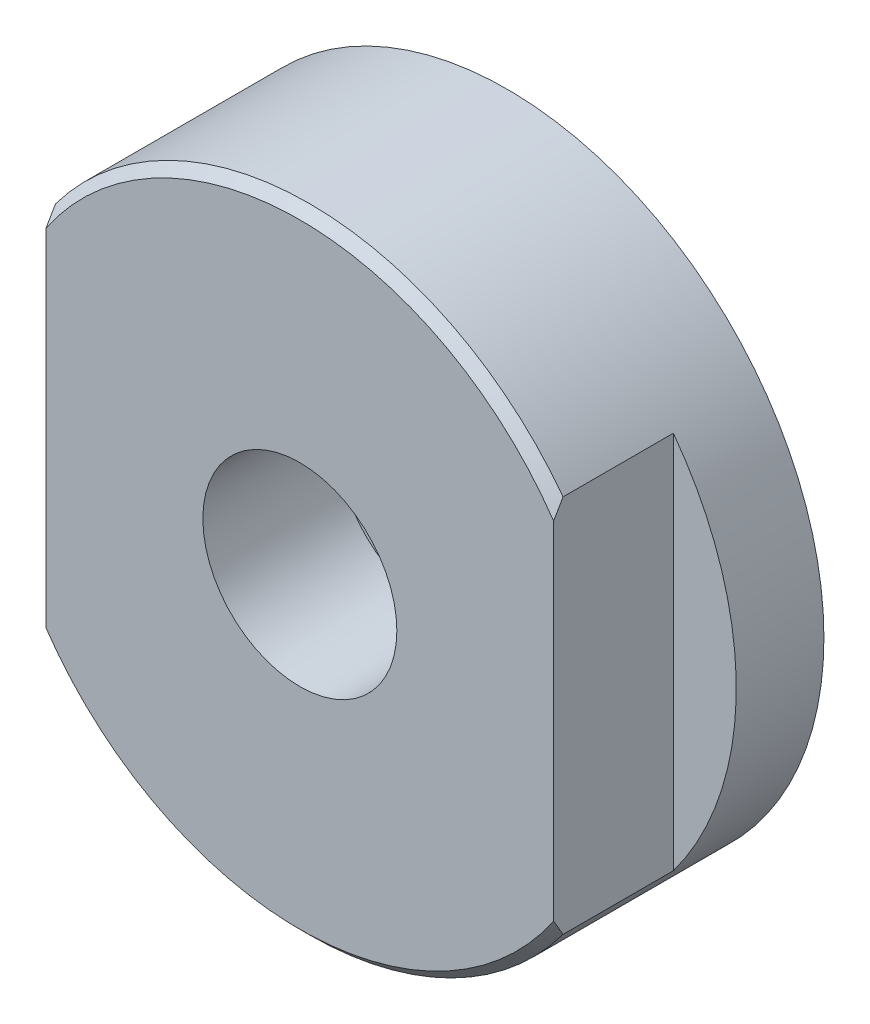
ISO-10303-21;
HEADER;
FILE_DESCRIPTION(('STEP AP214'),'2;1');
FILE_NAME('part.step','',(''),(''),'','','');
FILE_SCHEMA(('AUTOMOTIVE_DESIGN { 1 0 10303 214 1 1 1 1 }'));
ENDSEC;
DATA;
#1=APPLICATION_CONTEXT('core data for automotive mechanical design processes');
#2=APPLICATION_PROTOCOL_DEFINITION('international standard','automotive_design',2000,#1);
#3=PRODUCT_CONTEXT('',#1,'mechanical');
#4=PRODUCT('Part','Part','',(#3));
#5=PRODUCT_RELATED_PRODUCT_CATEGORY('part','',(#4));
#6=PRODUCT_DEFINITION_FORMATION('','',#4);
#7=PRODUCT_DEFINITION_CONTEXT('part definition',#1,'design');
#8=PRODUCT_DEFINITION('design','',#6,#7);
#9=PRODUCT_DEFINITION_SHAPE('','',#8);
#10=(LENGTH_UNIT() NAMED_UNIT(*) SI_UNIT(.MILLI.,.METRE.));
#11=(NAMED_UNIT(*) PLANE_ANGLE_UNIT() SI_UNIT($,.RADIAN.));
#12=(NAMED_UNIT(*) SI_UNIT($,.STERADIAN.) SOLID_ANGLE_UNIT());
#13=UNCERTAINTY_MEASURE_WITH_UNIT(LENGTH_MEASURE(1.E-05),#10,'distance_accuracy_value','');
#14=(GEOMETRIC_REPRESENTATION_CONTEXT(3) GLOBAL_UNCERTAINTY_ASSIGNED_CONTEXT((#13)) GLOBAL_UNIT_ASSIGNED_CONTEXT((#10,
#11,#12)) REPRESENTATION_CONTEXT('',''));
#15=CARTESIAN_POINT('',(0.,0.,0.));
#16=DIRECTION('',(0.,0.,1.));
#17=DIRECTION('',(1.,0.,0.));
#18=AXIS2_PLACEMENT_3D('',#15,#16,#17);
#19=CARTESIAN_POINT('',(0.,0.,11.));
#20=DIRECTION('',(0.,0.,-1.));
#21=DIRECTION('',(-1.,0.,0.));
#22=AXIS2_PLACEMENT_3D('',#19,#20,#21);
#23=CONICAL_SURFACE('',#22,16.3,0.785398163397448);
#24=CARTESIAN_POINT('',(13.462,22.1152500664714,1.40965953289599));
#25=CARTESIAN_POINT('',(13.462,21.7843991031133,1.69225636626439));
#26=CARTESIAN_POINT('',(13.462,21.4527114023601,1.97387755733035));
#27=CARTESIAN_POINT('',(13.462,20.787439888017,2.53488411675067));
#28=CARTESIAN_POINT('',(13.462,20.453856037143,2.81426944087907));
#29=CARTESIAN_POINT('',(13.462,19.7844100512555,3.37065197990872));
#30=CARTESIAN_POINT('',(13.462,19.4485468300436,3.64764788895666));
#31=CARTESIAN_POINT('',(13.462,18.7744554387229,4.19874606361961));
#32=CARTESIAN_POINT('',(13.462,18.4362272783123,4.47284834108924));
#33=CARTESIAN_POINT('',(13.462,17.7479323295138,5.02509902126975));
#34=CARTESIAN_POINT('',(13.462,17.3977926072053,5.30315661342661));
#35=CARTESIAN_POINT('',(13.462,16.6943328703862,5.85521823765053));
#36=CARTESIAN_POINT('',(13.462,16.3410128803111,6.12922230082011));
#37=CARTESIAN_POINT('',(13.462,15.6308365063995,6.67244125849601));
#38=CARTESIAN_POINT('',(13.462,15.2739809698164,6.94165725915664));
#39=CARTESIAN_POINT('',(13.462,14.5561432359145,7.47453896209526));
#40=CARTESIAN_POINT('',(13.462,14.1951610412107,7.73820466789004));
#41=CARTESIAN_POINT('',(13.462,13.4677807908375,8.25946215770953));
#42=CARTESIAN_POINT('',(13.462,13.101373685025,8.51704133873447));
#43=CARTESIAN_POINT('',(13.462,12.3631263937469,9.0243221474891));
#44=CARTESIAN_POINT('',(13.462,11.9912861453437,9.27402368385807));
#45=CARTESIAN_POINT('',(13.462,11.2410522675208,9.76415234672223));
#46=CARTESIAN_POINT('',(13.462,10.8626531171971,10.0045710493569));
#47=CARTESIAN_POINT('',(13.462,10.0987398666719,10.4738555428562));
#48=CARTESIAN_POINT('',(13.462,9.71322591861934,10.7027215803827));
#49=CARTESIAN_POINT('',(13.462,8.93794836136059,11.1441401236943));
#50=CARTESIAN_POINT('',(13.462,8.54826397755875,11.3568310754449));
#51=CARTESIAN_POINT('',(13.462,7.7599826656596,11.7652292752714));
#52=CARTESIAN_POINT('',(13.462,7.36138471280793,11.9609345578226));
#53=CARTESIAN_POINT('',(13.462,6.5551630089602,12.3311114369306));
#54=CARTESIAN_POINT('',(13.462,6.14755531899303,12.5056177019946));
#55=CARTESIAN_POINT('',(13.462,5.32235412954674,12.8290342094595));
#56=CARTESIAN_POINT('',(13.462,4.90476331663721,12.9779512518133));
#57=CARTESIAN_POINT('',(13.462,4.04554000486839,13.2493585658461));
#58=CARTESIAN_POINT('',(13.462,3.60356994898546,13.3708039940975));
#59=CARTESIAN_POINT('',(13.462,2.93399810656554,13.5236990264686));
#60=CARTESIAN_POINT('',(13.462,2.70968468869802,13.5697879501569));
#61=CARTESIAN_POINT('',(13.462,2.25917767773502,13.651545734528));
#62=CARTESIAN_POINT('',(13.462,2.03298434434993,13.6872160107238));
#63=CARTESIAN_POINT('',(13.462,1.58011710228641,13.7474333171114));
#64=CARTESIAN_POINT('',(13.462,1.35344953819499,13.7720279432535));
#65=CARTESIAN_POINT('',(13.462,0.899196178732622,13.8099005355743));
#66=CARTESIAN_POINT('',(13.462,0.671610511446186,13.8231800289648));
#67=CARTESIAN_POINT('',(13.462,0.216045910064114,13.8381913882505));
#68=CARTESIAN_POINT('',(13.462,-0.0119330421317525,13.8399227076682));
#69=CARTESIAN_POINT('',(13.462,-0.46768326249953,13.8318057585023));
#70=CARTESIAN_POINT('',(13.462,-0.695454530281543,13.8219574682243));
#71=CARTESIAN_POINT('',(13.462,-1.14972446421615,13.7908888983066));
#72=CARTESIAN_POINT('',(13.462,-1.37622481742138,13.7696932646963));
#73=CARTESIAN_POINT('',(13.462,-1.82793677577188,13.716317218805));
#74=CARTESIAN_POINT('',(13.462,-2.05314821448072,13.6841354190401));
#75=CARTESIAN_POINT('',(13.462,-2.72613196657787,13.5718576584461));
#76=CARTESIAN_POINT('',(13.462,-3.17134322782695,13.4760228768823));
#77=CARTESIAN_POINT('',(13.462,-4.05473703396553,13.2471408477532));
#78=CARTESIAN_POINT('',(13.462,-4.49286159319736,13.1138744003937));
#79=CARTESIAN_POINT('',(13.462,-5.14193417315292,12.8908492888588));
#80=CARTESIAN_POINT('',(13.462,-5.3569481875956,12.8126495730774));
#81=CARTESIAN_POINT('',(13.462,-5.78430227842242,12.6492441406957));
#82=CARTESIAN_POINT('',(13.462,-5.99664230136358,12.5640382843245));
#83=CARTESIAN_POINT('',(13.462,-6.77096127002108,12.2398090731213));
#84=CARTESIAN_POINT('',(13.462,-7.32489536266652,11.9814490164044));
#85=CARTESIAN_POINT('',(13.462,-8.41576364444576,11.430891216448));
#86=CARTESIAN_POINT('',(13.462,-8.95268695896395,11.1386723625092));
#87=CARTESIAN_POINT('',(13.462,-10.0129473610895,10.5281064051659));
#88=CARTESIAN_POINT('',(13.462,-10.5362517605686,10.2097029230341));
#89=CARTESIAN_POINT('',(13.462,-11.570308014653,9.55350960995729));
#90=CARTESIAN_POINT('',(13.462,-12.0810625739396,9.2157240094307));
#91=CARTESIAN_POINT('',(13.462,-13.0945731042191,8.52353256721298));
#92=CARTESIAN_POINT('',(13.462,-13.5972816626804,8.16905762079438));
#93=CARTESIAN_POINT('',(13.462,-14.594082478034,7.44819250038603));
#94=CARTESIAN_POINT('',(13.462,-15.0881743623627,7.08180181314176));
#95=CARTESIAN_POINT('',(13.462,-16.0685933829619,6.33997637063483));
#96=CARTESIAN_POINT('',(13.462,-16.55492892185,5.96455268983195));
#97=CARTESIAN_POINT('',(13.462,-17.5215817685607,5.20607525817664));
#98=CARTESIAN_POINT('',(13.462,-18.0018992315357,4.82302170469255));
#99=CARTESIAN_POINT('',(13.462,-18.7873259419885,4.18817770701107));
#100=CARTESIAN_POINT('',(13.462,-19.0939192164089,3.93821833819089));
#101=CARTESIAN_POINT('',(13.462,-19.7052566172668,3.4359643436651));
#102=CARTESIAN_POINT('',(13.462,-20.0100004877622,3.18366940641081));
#103=CARTESIAN_POINT('',(13.462,-20.6157166118332,2.67876125727252));
#104=CARTESIAN_POINT('',(13.462,-20.9167004191878,2.42616189440049));
#105=CARTESIAN_POINT('',(13.462,-21.5171006216023,1.91919407405614));
#106=CARTESIAN_POINT('',(13.462,-21.8165172358528,1.66482587622859));
#107=CARTESIAN_POINT('',(13.462,-22.1152500664714,1.40965953289599));
#108=B_SPLINE_CURVE_WITH_KNOTS('',3,(#24,#25,#26,#27,#28,#29,#30,#31,#32,#33,#34,#35,#36,#37,
#38,#39,#40,#41,#42,#43,#44,#45,#46,#47,#48,#49,#50,#51,#52,#53,#54,#55,#56,#57,#58,#59,#60,#61,
#62,#63,#64,#65,#66,#67,#68,#69,#70,#71,#72,#73,#74,#75,#76,#77,#78,#79,#80,#81,#82,#83,#84,#85,
#86,#87,#88,#89,#90,#91,#92,#93,#94,#95,#96,#97,#98,#99,#100,#101,#102,#103,#104,#105,#106,
#107),.UNSPECIFIED.,.F.,.F.,(4,2,2,2,2,2,2,2,2,2,2,2,2,2,2,2,2,2,2,2,2,2,2,2,2,2,2,2,2,2,2,2,2,
2,2,2,2,2,2,2,2,4),(0.,1.30534095296158,2.61070766237272,3.91674755127345,5.22278208751964,
6.56410812208407,7.90542385937738,9.24642558714189,10.5874264651956,11.930996215219,
13.2745815415243,14.6193587664932,15.9641072668725,17.2956142281385,18.6272750620651,
19.9567279348748,21.2858269772993,22.6591740227139,23.3459683099858,24.0326692435954,
24.7163903438836,25.4000191472137,26.0836803006884,26.7673427350047,27.4495262672904,
28.1317959869782,29.4960673036231,30.868500606911,31.5547749347786,32.241062956977,
34.0729684491996,35.9060223296379,37.7431318736884,39.5798419569545,41.4249736176352,
43.2701848604186,45.1132388184732,46.956245162454,48.1429580385022,49.3298315627222,
50.5086284528273,51.6872558155483),.UNSPECIFIED.);
#109=CARTESIAN_POINT('',(13.462,10.0505997830975,10.5));
#110=VERTEX_POINT('',#109);
#111=CARTESIAN_POINT('',(13.462,9.19046005377315,11.));
#112=VERTEX_POINT('',#111);
#113=EDGE_CURVE('E11',#110,#112,#108,.T.);
#114=ORIENTED_EDGE('',*,*,#113,.F.);
#115=CARTESIAN_POINT('',(0.,0.,10.5));
#116=DIRECTION('',(0.,0.,1.));
#117=DIRECTION('',(1.,0.,0.));
#118=AXIS2_PLACEMENT_3D('',#115,#116,#117);
#119=CIRCLE('',#118,16.8);
#120=CARTESIAN_POINT('',(-13.462,10.0505997830975,10.5));
#121=VERTEX_POINT('',#120);
#122=EDGE_CURVE('E107',#121,#110,#119,.F.);
#123=ORIENTED_EDGE('',*,*,#122,.F.);
#124=CARTESIAN_POINT('',(-13.462,-22.1152500664714,1.40965953289599));
#125=CARTESIAN_POINT('',(-13.462,-21.7843991031133,1.69225636626439));
#126=CARTESIAN_POINT('',(-13.462,-21.45271140236,1.97387755733034));
#127=CARTESIAN_POINT('',(-13.462,-20.787439888017,2.53488411675067));
#128=CARTESIAN_POINT('',(-13.462,-20.453856037143,2.81426944087907));
#129=CARTESIAN_POINT('',(-13.462,-19.7844100512555,3.37065197990872));
#130=CARTESIAN_POINT('',(-13.462,-19.4485468300436,3.64764788895666));
#131=CARTESIAN_POINT('',(-13.462,-18.7744554387229,4.19874606361961));
#132=CARTESIAN_POINT('',(-13.462,-18.4362272783123,4.47284834108924));
#133=CARTESIAN_POINT('',(-13.462,-17.7479323295138,5.02509902126975));
#134=CARTESIAN_POINT('',(-13.462,-17.3977926072053,5.30315661342661));
#135=CARTESIAN_POINT('',(-13.462,-16.6943328703862,5.85521823765053));
#136=CARTESIAN_POINT('',(-13.462,-16.3410128803111,6.12922230082011));
#137=CARTESIAN_POINT('',(-13.462,-15.6308365063995,6.67244125849601));
#138=CARTESIAN_POINT('',(-13.462,-15.2739809698164,6.94165725915664));
#139=CARTESIAN_POINT('',(-13.462,-14.5561432359145,7.47453896209526));
#140=CARTESIAN_POINT('',(-13.462,-14.1951610412107,7.73820466789004));
#141=CARTESIAN_POINT('',(-13.462,-13.4677807908375,8.25946215770953));
#142=CARTESIAN_POINT('',(-13.462,-13.101373685025,8.51704133873447));
#143=CARTESIAN_POINT('',(-13.462,-12.3631263937469,9.0243221474891));
#144=CARTESIAN_POINT('',(-13.462,-11.9912861453437,9.27402368385807));
#145=CARTESIAN_POINT('',(-13.462,-11.2410522675208,9.76415234672223));
#146=CARTESIAN_POINT('',(-13.462,-10.8626531171971,10.0045710493569));
#147=CARTESIAN_POINT('',(-13.462,-10.0987398666719,10.4738555428562));
#148=CARTESIAN_POINT('',(-13.462,-9.71322591861934,10.7027215803827));
#149=CARTESIAN_POINT('',(-13.462,-8.93794836136059,11.1441401236943));
#150=CARTESIAN_POINT('',(-13.462,-8.54826397755875,11.3568310754449));
#151=CARTESIAN_POINT('',(-13.462,-7.7599826656596,11.7652292752714));
#152=CARTESIAN_POINT('',(-13.462,-7.36138471280793,11.9609345578226));
#153=CARTESIAN_POINT('',(-13.462,-6.5551630089602,12.3311114369306));
#154=CARTESIAN_POINT('',(-13.462,-6.14755531899303,12.5056177019946));
#155=CARTESIAN_POINT('',(-13.462,-5.32235412954674,12.8290342094595));
#156=CARTESIAN_POINT('',(-13.462,-4.90476331663721,12.9779512518133));
#157=CARTESIAN_POINT('',(-13.462,-4.04554000486839,13.2493585658461));
#158=CARTESIAN_POINT('',(-13.462,-3.60356994898546,13.3708039940975));
#159=CARTESIAN_POINT('',(-13.462,-2.93399810656554,13.5236990264686));
#160=CARTESIAN_POINT('',(-13.462,-2.70968468869802,13.5697879501569));
#161=CARTESIAN_POINT('',(-13.462,-2.25917767773502,13.651545734528));
#162=CARTESIAN_POINT('',(-13.462,-2.03298434434993,13.6872160107238));
#163=CARTESIAN_POINT('',(-13.462,-1.58011710228641,13.7474333171114));
#164=CARTESIAN_POINT('',(-13.462,-1.35344953819499,13.7720279432535));
#165=CARTESIAN_POINT('',(-13.462,-0.899196178732622,13.8099005355743));
#166=CARTESIAN_POINT('',(-13.462,-0.671610511446186,13.8231800289648));
#167=CARTESIAN_POINT('',(-13.462,-0.216045910064114,13.8381913882505));
#168=CARTESIAN_POINT('',(-13.462,0.0119330421317525,13.8399227076682));
#169=CARTESIAN_POINT('',(-13.462,0.46768326249953,13.8318057585023));
#170=CARTESIAN_POINT('',(-13.462,0.695454530281543,13.8219574682243));
#171=CARTESIAN_POINT('',(-13.462,1.14972446421615,13.7908888983066));
#172=CARTESIAN_POINT('',(-13.462,1.37622481742138,13.7696932646963));
#173=CARTESIAN_POINT('',(-13.462,1.82793677577188,13.716317218805));
#174=CARTESIAN_POINT('',(-13.462,2.05314821448072,13.6841354190401));
#175=CARTESIAN_POINT('',(-13.462,2.72613196657787,13.5718576584461));
#176=CARTESIAN_POINT('',(-13.462,3.17134322782695,13.4760228768823));
#177=CARTESIAN_POINT('',(-13.462,4.05473703396553,13.2471408477532));
#178=CARTESIAN_POINT('',(-13.462,4.49286159319736,13.1138744003937));
#179=CARTESIAN_POINT('',(-13.462,5.14193417315292,12.8908492888588));
#180=CARTESIAN_POINT('',(-13.462,5.3569481875956,12.8126495730774));
#181=CARTESIAN_POINT('',(-13.462,5.78430227842242,12.6492441406957));
#182=CARTESIAN_POINT('',(-13.462,5.99664230136358,12.5640382843245));
#183=CARTESIAN_POINT('',(-13.462,6.77096127002108,12.2398090731213));
#184=CARTESIAN_POINT('',(-13.462,7.32489536266652,11.9814490164044));
#185=CARTESIAN_POINT('',(-13.462,8.41576364444576,11.430891216448));
#186=CARTESIAN_POINT('',(-13.462,8.95268695896395,11.1386723625092));
#187=CARTESIAN_POINT('',(-13.462,10.0129473610895,10.5281064051659));
#188=CARTESIAN_POINT('',(-13.462,10.5362517605686,10.2097029230341));
#189=CARTESIAN_POINT('',(-13.462,11.570308014653,9.55350960995729));
#190=CARTESIAN_POINT('',(-13.462,12.0810625739396,9.2157240094307));
#191=CARTESIAN_POINT('',(-13.462,13.0945731042191,8.52353256721298));
#192=CARTESIAN_POINT('',(-13.462,13.5972816626804,8.16905762079438));
#193=CARTESIAN_POINT('',(-13.462,14.594082478034,7.44819250038603));
#194=CARTESIAN_POINT('',(-13.462,15.0881743623627,7.08180181314176));
#195=CARTESIAN_POINT('',(-13.462,16.0685933829619,6.33997637063483));
#196=CARTESIAN_POINT('',(-13.462,16.55492892185,5.96455268983195));
#197=CARTESIAN_POINT('',(-13.462,17.5215817685607,5.20607525817664));
#198=CARTESIAN_POINT('',(-13.462,18.0018992315357,4.82302170469255));
#199=CARTESIAN_POINT('',(-13.462,18.7873259419885,4.18817770701107));
#200=CARTESIAN_POINT('',(-13.462,19.0939192164089,3.93821833819089));
#201=CARTESIAN_POINT('',(-13.462,19.7052566172668,3.4359643436651));
#202=CARTESIAN_POINT('',(-13.462,20.0100004877622,3.18366940641081));
#203=CARTESIAN_POINT('',(-13.462,20.6157166118332,2.67876125727252));
#204=CARTESIAN_POINT('',(-13.462,20.9167004191878,2.42616189440049));
#205=CARTESIAN_POINT('',(-13.462,21.5171006216023,1.91919407405614));
#206=CARTESIAN_POINT('',(-13.462,21.8165172358528,1.66482587622859));
#207=CARTESIAN_POINT('',(-13.462,22.1152500664714,1.40965953289599));
#208=B_SPLINE_CURVE_WITH_KNOTS('',3,(#124,#125,#126,#127,#128,#129,#130,#131,#132,#133,#134,
#135,#136,#137,#138,#139,#140,#141,#142,#143,#144,#145,#146,#147,#148,#149,#150,#151,#152,#153,
#154,#155,#156,#157,#158,#159,#160,#161,#162,#163,#164,#165,#166,#167,#168,#169,#170,#171,#172,
#173,#174,#175,#176,#177,#178,#179,#180,#181,#182,#183,#184,#185,#186,#187,#188,#189,#190,#191,
#192,#193,#194,#195,#196,#197,#198,#199,#200,#201,#202,#203,#204,#205,#206,#207),.UNSPECIFIED.,
.F.,.F.,(4,2,2,2,2,2,2,2,2,2,2,2,2,2,2,2,2,2,2,2,2,2,2,2,2,2,2,2,2,2,2,2,2,2,2,2,2,2,2,2,2,4),
(0.,1.30534095296158,2.61070766237272,3.91674755127344,5.22278208751964,6.56410812208406,
7.90542385937738,9.24642558714189,10.5874264651956,11.930996215219,13.2745815415243,
14.6193587664932,15.9641072668725,17.2956142281385,18.6272750620651,19.9567279348748,
21.2858269772993,22.6591740227139,23.3459683099858,24.0326692435954,24.7163903438836,
25.4000191472137,26.0836803006884,26.7673427350047,27.4495262672904,28.1317959869782,
29.4960673036231,30.868500606911,31.5547749347786,32.241062956977,34.0729684491996,
35.9060223296379,37.7431318736884,39.5798419569545,41.4249736176352,43.2701848604186,
45.1132388184732,46.956245162454,48.1429580385022,49.3298315627222,50.5086284528273,
51.6872558155483),.UNSPECIFIED.);
#209=CARTESIAN_POINT('',(-13.462,9.19046005377315,11.));
#210=VERTEX_POINT('',#209);
#211=EDGE_CURVE('E132',#210,#121,#208,.T.);
#212=ORIENTED_EDGE('',*,*,#211,.F.);
#213=CARTESIAN_POINT('',(0.,0.,11.));
#214=DIRECTION('',(0.,0.,1.));
#215=DIRECTION('',(1.,0.,0.));
#216=AXIS2_PLACEMENT_3D('',#213,#214,#215);
#217=CIRCLE('',#216,16.3);
#218=EDGE_CURVE('E57',#112,#210,#217,.T.);
#219=ORIENTED_EDGE('',*,*,#218,.F.);
#220=EDGE_LOOP('',(#114,#123,#212,#219));
#221=FACE_BOUND('',#220,.T.);
#222=ADVANCED_FACE('F34',(#221),#23,.T.);
#223=CARTESIAN_POINT('',(0.,0.,11.));
#224=DIRECTION('',(0.,0.,-1.));
#225=DIRECTION('',(-1.,0.,0.));
#226=AXIS2_PLACEMENT_3D('',#223,#224,#225);
#227=CYLINDRICAL_SURFACE('',#226,16.8);
#228=ORIENTED_EDGE('',*,*,#122,.T.);
#229=DIRECTION('',(0.,0.,1.));
#230=VECTOR('',#229,1.);
#231=CARTESIAN_POINT('',(13.462,10.0505997830975,4.65));
#232=LINE('',#231,#230);
#233=CARTESIAN_POINT('',(13.462,10.0505997830975,4.65));
#234=VERTEX_POINT('',#233);
#235=EDGE_CURVE('E98',#234,#110,#232,.T.);
#236=ORIENTED_EDGE('',*,*,#235,.F.);
#237=CARTESIAN_POINT('',(0.,0.,4.65));
#238=DIRECTION('',(0.,0.,1.));
#239=DIRECTION('',(-1.,0.,0.));
#240=AXIS2_PLACEMENT_3D('',#237,#238,#239);
#241=CIRCLE('',#240,16.8);
#242=CARTESIAN_POINT('',(13.462,-10.0505997830975,4.65));
#243=VERTEX_POINT('',#242);
#244=EDGE_CURVE('E89',#243,#234,#241,.T.);
#245=ORIENTED_EDGE('',*,*,#244,.F.);
#246=DIRECTION('',(0.,0.,1.));
#247=VECTOR('',#246,1.);
#248=CARTESIAN_POINT('',(13.462,-10.0505997830975,4.65));
#249=LINE('',#248,#247);
#250=CARTESIAN_POINT('',(13.462,-10.0505997830975,10.5));
#251=VERTEX_POINT('',#250);
#252=EDGE_CURVE('E100',#243,#251,#249,.T.);
#253=ORIENTED_EDGE('',*,*,#252,.T.);
#254=CARTESIAN_POINT('',(-13.462,-10.0505997830975,10.5));
#255=VERTEX_POINT('',#254);
#256=EDGE_CURVE('E130',#251,#255,#119,.F.);
#257=ORIENTED_EDGE('',*,*,#256,.T.);
#258=DIRECTION('',(0.,0.,1.));
#259=VECTOR('',#258,1.);
#260=CARTESIAN_POINT('',(-13.462,-10.0505997830975,4.65));
#261=LINE('',#260,#259);
#262=CARTESIAN_POINT('',(-13.462,-10.0505997830975,4.65));
#263=VERTEX_POINT('',#262);
#264=EDGE_CURVE('E118',#263,#255,#261,.T.);
#265=ORIENTED_EDGE('',*,*,#264,.F.);
#266=CARTESIAN_POINT('',(0.,0.,4.65));
#267=DIRECTION('',(0.,0.,1.));
#268=DIRECTION('',(1.,0.,0.));
#269=AXIS2_PLACEMENT_3D('',#266,#267,#268);
#270=CIRCLE('',#269,16.8);
#271=CARTESIAN_POINT('',(-13.462,10.0505997830975,4.65));
#272=VERTEX_POINT('',#271);
#273=EDGE_CURVE('E113',#272,#263,#270,.T.);
#274=ORIENTED_EDGE('',*,*,#273,.F.);
#275=DIRECTION('',(0.,0.,1.));
#276=VECTOR('',#275,1.);
#277=CARTESIAN_POINT('',(-13.462,10.0505997830975,4.65));
#278=LINE('',#277,#276);
#279=EDGE_CURVE('E120',#272,#121,#278,.T.);
#280=ORIENTED_EDGE('',*,*,#279,.T.);
#281=EDGE_LOOP('',(#228,#236,#245,#253,#257,#265,#274,#280));
#282=FACE_BOUND('',#281,.T.);
#283=CARTESIAN_POINT('',(0.,0.,0.));
#284=DIRECTION('',(0.,0.,1.));
#285=DIRECTION('',(1.,0.,0.));
#286=AXIS2_PLACEMENT_3D('',#283,#284,#285);
#287=CIRCLE('',#286,16.8);
#288=CARTESIAN_POINT('',(16.8,0.,0.));
#289=VERTEX_POINT('',#288);
#290=EDGE_CURVE('E122',#289,#289,#287,.T.);
#291=ORIENTED_EDGE('',*,*,#290,.T.);
#292=EDGE_LOOP('',(#291));
#293=FACE_BOUND('',#292,.T.);
#294=ADVANCED_FACE('F103',(#282,#293),#227,.T.);
#295=CARTESIAN_POINT('',(0.,0.,11.));
#296=DIRECTION('',(0.,0.,1.));
#297=DIRECTION('',(1.,0.,0.));
#298=AXIS2_PLACEMENT_3D('',#295,#296,#297);
#299=PLANE('',#298);
#300=CARTESIAN_POINT('',(0.,0.,11.));
#301=DIRECTION('',(0.,0.,1.));
#302=DIRECTION('',(1.,0.,0.));
#303=AXIS2_PLACEMENT_3D('',#300,#301,#302);
#304=CIRCLE('',#303,5.1457733);
#305=CARTESIAN_POINT('',(5.1457733,0.,11.));
#306=VERTEX_POINT('',#305);
#307=EDGE_CURVE('E204',#306,#306,#304,.T.);
#308=ORIENTED_EDGE('',*,*,#307,.F.);
#309=EDGE_LOOP('',(#308));
#310=FACE_BOUND('',#309,.T.);
#311=DIRECTION('',(0.,-1.,0.));
#312=VECTOR('',#311,1.);
#313=CARTESIAN_POINT('',(13.462,-10.0505997830975,11.));
#314=LINE('',#313,#312);
#315=CARTESIAN_POINT('',(13.462,-9.19046005377315,11.));
#316=VERTEX_POINT('',#315);
#317=EDGE_CURVE('E50',#112,#316,#314,.T.);
#318=ORIENTED_EDGE('',*,*,#317,.F.);
#319=ORIENTED_EDGE('',*,*,#218,.T.);
#320=DIRECTION('',(0.,1.,0.));
#321=VECTOR('',#320,1.);
#322=CARTESIAN_POINT('',(-13.462,-10.0505997830975,11.));
#323=LINE('',#322,#321);
#324=CARTESIAN_POINT('',(-13.462,-9.19046005377315,11.));
#325=VERTEX_POINT('',#324);
#326=EDGE_CURVE('E109',#325,#210,#323,.T.);
#327=ORIENTED_EDGE('',*,*,#326,.F.);
#328=EDGE_CURVE('E127',#325,#316,#217,.T.);
#329=ORIENTED_EDGE('',*,*,#328,.T.);
#330=EDGE_LOOP('',(#318,#319,#327,#329));
#331=FACE_BOUND('',#330,.T.);
#332=ADVANCED_FACE('F149',(#310,#331),#299,.T.);
#333=CARTESIAN_POINT('',(0.,0.,0.));
#334=DIRECTION('',(0.,0.,1.));
#335=DIRECTION('',(1.,0.,0.));
#336=AXIS2_PLACEMENT_3D('',#333,#334,#335);
#337=PLANE('',#336);
#338=CARTESIAN_POINT('',(0.,0.,0.));
#339=DIRECTION('',(0.,0.,1.));
#340=DIRECTION('',(1.,0.,0.));
#341=AXIS2_PLACEMENT_3D('',#338,#339,#340);
#342=CIRCLE('',#341,4.2164);
#343=CARTESIAN_POINT('',(4.2164,0.,0.));
#344=VERTEX_POINT('',#343);
#345=EDGE_CURVE('E39',#344,#344,#342,.T.);
#346=ORIENTED_EDGE('',*,*,#345,.T.);
#347=EDGE_LOOP('',(#346));
#348=FACE_BOUND('',#347,.T.);
#349=ORIENTED_EDGE('',*,*,#290,.F.);
#350=EDGE_LOOP('',(#349));
#351=FACE_BOUND('',#350,.T.);
#352=ADVANCED_FACE('F152',(#348,#351),#337,.F.);
#353=EDGE_CURVE('E44',#316,#251,#108,.T.);
#354=ORIENTED_EDGE('',*,*,#353,.F.);
#355=ORIENTED_EDGE('',*,*,#328,.F.);
#356=EDGE_CURVE('E137',#255,#325,#208,.T.);
#357=ORIENTED_EDGE('',*,*,#356,.F.);
#358=ORIENTED_EDGE('',*,*,#256,.F.);
#359=EDGE_LOOP('',(#354,#355,#357,#358));
#360=FACE_BOUND('',#359,.T.);
#361=ADVANCED_FACE('F36',(#360),#23,.T.);
#362=CARTESIAN_POINT('',(-13.462,-10.0505997830975,4.65));
#363=DIRECTION('',(1.,0.,0.));
#364=DIRECTION('',(0.,0.,-1.));
#365=AXIS2_PLACEMENT_3D('',#362,#363,#364);
#366=PLANE('',#365);
#367=ORIENTED_EDGE('',*,*,#356,.T.);
#368=ORIENTED_EDGE('',*,*,#326,.T.);
#369=ORIENTED_EDGE('',*,*,#211,.T.);
#370=ORIENTED_EDGE('',*,*,#279,.F.);
#371=DIRECTION('',(0.,1.,0.));
#372=VECTOR('',#371,1.);
#373=CARTESIAN_POINT('',(-13.462,-10.0505997830975,4.65));
#374=LINE('',#373,#372);
#375=EDGE_CURVE('E115',#263,#272,#374,.T.);
#376=ORIENTED_EDGE('',*,*,#375,.F.);
#377=ORIENTED_EDGE('',*,*,#264,.T.);
#378=EDGE_LOOP('',(#367,#368,#369,#370,#376,#377));
#379=FACE_BOUND('',#378,.T.);
#380=ADVANCED_FACE('F142',(#379),#366,.F.);
#381=CARTESIAN_POINT('',(0.,0.,4.65));
#382=DIRECTION('',(0.,0.,1.));
#383=DIRECTION('',(1.,0.,0.));
#384=AXIS2_PLACEMENT_3D('',#381,#382,#383);
#385=PLANE('',#384);
#386=ORIENTED_EDGE('',*,*,#273,.T.);
#387=ORIENTED_EDGE('',*,*,#375,.T.);
#388=EDGE_LOOP('',(#386,#387));
#389=FACE_BOUND('',#388,.T.);
#390=ADVANCED_FACE('F147',(#389),#385,.T.);
#391=CARTESIAN_POINT('',(13.462,-10.0505997830975,4.65));
#392=DIRECTION('',(-1.,0.,0.));
#393=DIRECTION('',(0.,0.,1.));
#394=AXIS2_PLACEMENT_3D('',#391,#392,#393);
#395=PLANE('',#394);
#396=ORIENTED_EDGE('',*,*,#113,.T.);
#397=ORIENTED_EDGE('',*,*,#317,.T.);
#398=ORIENTED_EDGE('',*,*,#353,.T.);
#399=ORIENTED_EDGE('',*,*,#252,.F.);
#400=DIRECTION('',(0.,-1.,0.));
#401=VECTOR('',#400,1.);
#402=CARTESIAN_POINT('',(13.462,-10.0505997830975,4.65));
#403=LINE('',#402,#401);
#404=EDGE_CURVE('E92',#234,#243,#403,.T.);
#405=ORIENTED_EDGE('',*,*,#404,.F.);
#406=ORIENTED_EDGE('',*,*,#235,.T.);
#407=EDGE_LOOP('',(#396,#397,#398,#399,#405,#406));
#408=FACE_BOUND('',#407,.T.);
#409=ADVANCED_FACE('F97',(#408),#395,.F.);
#410=CARTESIAN_POINT('',(0.,0.,4.65));
#411=DIRECTION('',(0.,0.,-1.));
#412=DIRECTION('',(-1.,0.,0.));
#413=AXIS2_PLACEMENT_3D('',#410,#411,#412);
#414=PLANE('',#413);
#415=ORIENTED_EDGE('',*,*,#244,.T.);
#416=ORIENTED_EDGE('',*,*,#404,.T.);
#417=EDGE_LOOP('',(#415,#416));
#418=FACE_BOUND('',#417,.T.);
#419=ADVANCED_FACE('F91',(#418),#414,.F.);
#420=CARTESIAN_POINT('',(0.,0.,11.));
#421=DIRECTION('',(0.,0.,1.));
#422=DIRECTION('',(1.,0.,0.));
#423=AXIS2_PLACEMENT_3D('',#420,#421,#422);
#424=CYLINDRICAL_SURFACE('',#423,4.2164);
#425=CARTESIAN_POINT('',(0.,0.,4.));
#426=DIRECTION('',(0.,0.,1.));
#427=DIRECTION('',(1.,0.,0.));
#428=AXIS2_PLACEMENT_3D('',#425,#426,#427);
#429=CIRCLE('',#428,4.2164);
#430=CARTESIAN_POINT('',(4.2164,0.,4.));
#431=VERTEX_POINT('',#430);
#432=EDGE_CURVE('E206',#431,#431,#429,.T.);
#433=ORIENTED_EDGE('',*,*,#432,.T.);
#434=EDGE_LOOP('',(#433));
#435=FACE_BOUND('',#434,.T.);
#436=ORIENTED_EDGE('',*,*,#345,.F.);
#437=EDGE_LOOP('',(#436));
#438=FACE_BOUND('',#437,.T.);
#439=ADVANCED_FACE('F182',(#435,#438),#424,.F.);
#440=CARTESIAN_POINT('',(4.2164,0.,4.));
#441=DIRECTION('',(0.,0.,-1.));
#442=DIRECTION('',(-1.,0.,0.));
#443=AXIS2_PLACEMENT_3D('',#440,#441,#442);
#444=PLANE('',#443);
#445=ORIENTED_EDGE('',*,*,#432,.F.);
#446=EDGE_LOOP('',(#445));
#447=FACE_BOUND('',#446,.T.);
#448=CARTESIAN_POINT('',(0.,0.,4.));
#449=DIRECTION('',(0.,0.,1.));
#450=DIRECTION('',(1.,0.,0.));
#451=AXIS2_PLACEMENT_3D('',#448,#449,#450);
#452=CIRCLE('',#451,4.93618392580628);
#453=CARTESIAN_POINT('',(4.93618392580628,0.,4.));
#454=VERTEX_POINT('',#453);
#455=EDGE_CURVE('E201',#454,#454,#452,.T.);
#456=ORIENTED_EDGE('',*,*,#455,.T.);
#457=EDGE_LOOP('',(#456));
#458=FACE_BOUND('',#457,.T.);
#459=ADVANCED_FACE('F188',(#447,#458),#444,.F.);
#460=CARTESIAN_POINT('',(0.,0.,11.));
#461=DIRECTION('',(0.,0.,1.));
#462=DIRECTION('',(1.,0.,0.));
#463=AXIS2_PLACEMENT_3D('',#460,#461,#462);
#464=CONICAL_SURFACE('',#463,5.1457733,0.0299323966717027);
#465=ORIENTED_EDGE('',*,*,#455,.F.);
#466=EDGE_LOOP('',(#465));
#467=FACE_BOUND('',#466,.T.);
#468=ORIENTED_EDGE('',*,*,#307,.T.);
#469=EDGE_LOOP('',(#468));
#470=FACE_BOUND('',#469,.T.);
#471=ADVANCED_FACE('F192',(#467,#470),#464,.F.);
#472=CLOSED_SHELL('',(#222,#294,#332,#352,#361,#380,#390,#409,#419,#439,#459,#471));
#473=MANIFOLD_SOLID_BREP('B2',#472);
#474=ADVANCED_BREP_SHAPE_REPRESENTATION('',(#18,#473),#14);
#475=SHAPE_DEFINITION_REPRESENTATION(#9,#474);
ENDSEC;
END-ISO-10303-21;
